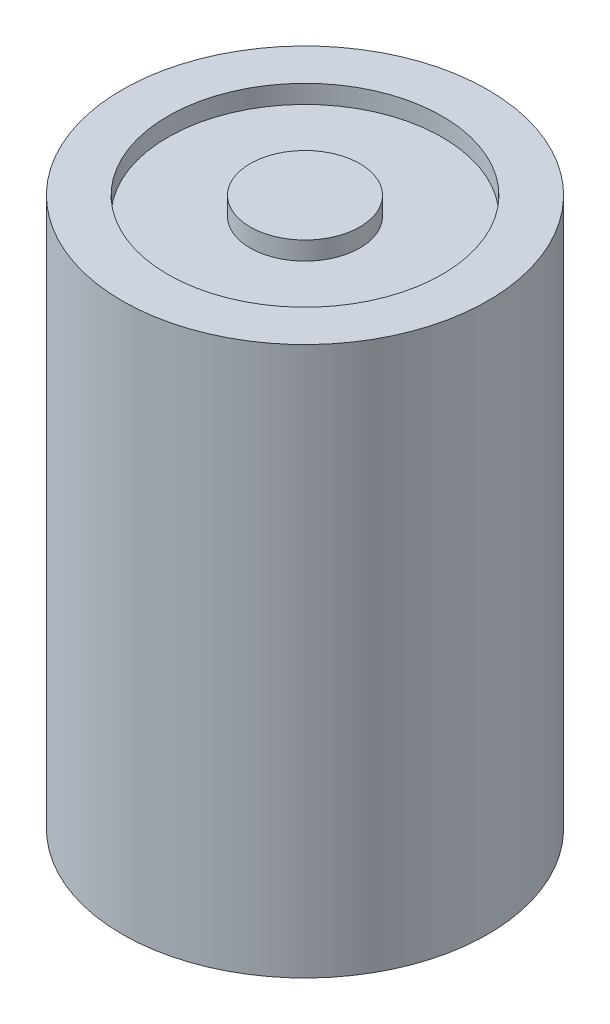
ISO-10303-21;
HEADER;
FILE_DESCRIPTION(('STEP AP214'),'2;1');
FILE_NAME('part.step','',(''),(''),'','','');
FILE_SCHEMA(('AUTOMOTIVE_DESIGN { 1 0 10303 214 1 1 1 1 }'));
ENDSEC;
DATA;
#1=APPLICATION_CONTEXT('core data for automotive mechanical design processes');
#2=APPLICATION_PROTOCOL_DEFINITION('international standard','automotive_design',2000,#1);
#3=PRODUCT_CONTEXT('',#1,'mechanical');
#4=PRODUCT('Part','Part','',(#3));
#5=PRODUCT_RELATED_PRODUCT_CATEGORY('part','',(#4));
#6=PRODUCT_DEFINITION_FORMATION('','',#4);
#7=PRODUCT_DEFINITION_CONTEXT('part definition',#1,'design');
#8=PRODUCT_DEFINITION('design','',#6,#7);
#9=PRODUCT_DEFINITION_SHAPE('','',#8);
#10=(LENGTH_UNIT() NAMED_UNIT(*) SI_UNIT(.MILLI.,.METRE.));
#11=(NAMED_UNIT(*) PLANE_ANGLE_UNIT() SI_UNIT($,.RADIAN.));
#12=(NAMED_UNIT(*) SI_UNIT($,.STERADIAN.) SOLID_ANGLE_UNIT());
#13=UNCERTAINTY_MEASURE_WITH_UNIT(LENGTH_MEASURE(1.E-05),#10,'distance_accuracy_value','');
#14=(GEOMETRIC_REPRESENTATION_CONTEXT(3) GLOBAL_UNCERTAINTY_ASSIGNED_CONTEXT((#13)) GLOBAL_UNIT_ASSIGNED_CONTEXT((#10,
#11,#12)) REPRESENTATION_CONTEXT('',''));
#15=CARTESIAN_POINT('',(0.,0.,0.));
#16=DIRECTION('',(0.,0.,1.));
#17=DIRECTION('',(1.,0.,0.));
#18=AXIS2_PLACEMENT_3D('',#15,#16,#17);
#19=CARTESIAN_POINT('',(0.,30.,0.));
#20=DIRECTION('',(0.,-1.,0.));
#21=DIRECTION('',(0.,0.,-1.));
#22=AXIS2_PLACEMENT_3D('',#19,#20,#21);
#23=CYLINDRICAL_SURFACE('',#22,10.);
#24=CARTESIAN_POINT('',(0.,30.,0.));
#25=DIRECTION('',(0.,1.,0.));
#26=DIRECTION('',(0.,0.,1.));
#27=AXIS2_PLACEMENT_3D('',#24,#25,#26);
#28=CIRCLE('',#27,10.);
#29=CARTESIAN_POINT('',(0.,30.,10.));
#30=VERTEX_POINT('',#29);
#31=EDGE_CURVE('E10',#30,#30,#28,.T.);
#32=ORIENTED_EDGE('',*,*,#31,.F.);
#33=EDGE_LOOP('',(#32));
#34=FACE_BOUND('',#33,.T.);
#35=CARTESIAN_POINT('',(0.,0.,0.));
#36=DIRECTION('',(0.,1.,0.));
#37=DIRECTION('',(0.,0.,1.));
#38=AXIS2_PLACEMENT_3D('',#35,#36,#37);
#39=CIRCLE('',#38,10.);
#40=CARTESIAN_POINT('',(0.,0.,10.));
#41=VERTEX_POINT('',#40);
#42=EDGE_CURVE('E46',#41,#41,#39,.T.);
#43=ORIENTED_EDGE('',*,*,#42,.T.);
#44=EDGE_LOOP('',(#43));
#45=FACE_BOUND('',#44,.T.);
#46=ADVANCED_FACE('F43',(#34,#45),#23,.T.);
#47=CARTESIAN_POINT('',(0.,30.,0.));
#48=DIRECTION('',(0.,1.,0.));
#49=DIRECTION('',(0.,0.,1.));
#50=AXIS2_PLACEMENT_3D('',#47,#48,#49);
#51=PLANE('',#50);
#52=CARTESIAN_POINT('',(0.,30.,0.));
#53=DIRECTION('',(0.,1.,0.));
#54=DIRECTION('',(0.,0.,1.));
#55=AXIS2_PLACEMENT_3D('',#52,#53,#54);
#56=CIRCLE('',#55,7.5);
#57=CARTESIAN_POINT('',(0.,30.,7.5));
#58=VERTEX_POINT('',#57);
#59=EDGE_CURVE('E57',#58,#58,#56,.T.);
#60=ORIENTED_EDGE('',*,*,#59,.F.);
#61=EDGE_LOOP('',(#60));
#62=FACE_BOUND('',#61,.T.);
#63=ORIENTED_EDGE('',*,*,#31,.T.);
#64=EDGE_LOOP('',(#63));
#65=FACE_BOUND('',#64,.T.);
#66=ADVANCED_FACE('F89',(#62,#65),#51,.T.);
#67=CARTESIAN_POINT('',(0.,0.,0.));
#68=DIRECTION('',(0.,1.,0.));
#69=DIRECTION('',(0.,0.,1.));
#70=AXIS2_PLACEMENT_3D('',#67,#68,#69);
#71=PLANE('',#70);
#72=ORIENTED_EDGE('',*,*,#42,.F.);
#73=EDGE_LOOP('',(#72));
#74=FACE_BOUND('',#73,.T.);
#75=ADVANCED_FACE('F85',(#74),#71,.F.);
#76=CARTESIAN_POINT('',(0.,29.,0.));
#77=DIRECTION('',(0.,1.,0.));
#78=DIRECTION('',(0.,0.,1.));
#79=AXIS2_PLACEMENT_3D('',#76,#77,#78);
#80=CYLINDRICAL_SURFACE('',#79,7.5);
#81=CARTESIAN_POINT('',(0.,29.,0.));
#82=DIRECTION('',(0.,1.,0.));
#83=DIRECTION('',(0.,0.,1.));
#84=AXIS2_PLACEMENT_3D('',#81,#82,#83);
#85=CIRCLE('',#84,7.5);
#86=CARTESIAN_POINT('',(0.,29.,7.5));
#87=VERTEX_POINT('',#86);
#88=EDGE_CURVE('E55',#87,#87,#85,.T.);
#89=ORIENTED_EDGE('',*,*,#88,.F.);
#90=EDGE_LOOP('',(#89));
#91=FACE_BOUND('',#90,.T.);
#92=ORIENTED_EDGE('',*,*,#59,.T.);
#93=EDGE_LOOP('',(#92));
#94=FACE_BOUND('',#93,.T.);
#95=ADVANCED_FACE('F79',(#91,#94),#80,.F.);
#96=CARTESIAN_POINT('',(0.,29.,0.));
#97=DIRECTION('',(0.,1.,0.));
#98=DIRECTION('',(0.,0.,1.));
#99=AXIS2_PLACEMENT_3D('',#96,#97,#98);
#100=PLANE('',#99);
#101=CARTESIAN_POINT('',(0.,29.,0.));
#102=DIRECTION('',(0.,1.,0.));
#103=DIRECTION('',(0.,0.,1.));
#104=AXIS2_PLACEMENT_3D('',#101,#102,#103);
#105=CIRCLE('',#104,3.);
#106=CARTESIAN_POINT('',(0.,29.,3.));
#107=VERTEX_POINT('',#106);
#108=EDGE_CURVE('E61',#107,#107,#105,.T.);
#109=ORIENTED_EDGE('',*,*,#108,.F.);
#110=EDGE_LOOP('',(#109));
#111=FACE_BOUND('',#110,.T.);
#112=ORIENTED_EDGE('',*,*,#88,.T.);
#113=EDGE_LOOP('',(#112));
#114=FACE_BOUND('',#113,.T.);
#115=ADVANCED_FACE('F76',(#111,#114),#100,.T.);
#116=CARTESIAN_POINT('',(0.,29.,0.));
#117=DIRECTION('',(0.,1.,0.));
#118=DIRECTION('',(0.,0.,1.));
#119=AXIS2_PLACEMENT_3D('',#116,#117,#118);
#120=CYLINDRICAL_SURFACE('',#119,3.);
#121=ORIENTED_EDGE('',*,*,#108,.T.);
#122=EDGE_LOOP('',(#121));
#123=FACE_BOUND('',#122,.T.);
#124=CARTESIAN_POINT('',(0.,30.,0.));
#125=DIRECTION('',(0.,1.,0.));
#126=DIRECTION('',(0.,0.,1.));
#127=AXIS2_PLACEMENT_3D('',#124,#125,#126);
#128=CIRCLE('',#127,3.);
#129=CARTESIAN_POINT('',(0.,30.,3.));
#130=VERTEX_POINT('',#129);
#131=EDGE_CURVE('E65',#130,#130,#128,.T.);
#132=ORIENTED_EDGE('',*,*,#131,.F.);
#133=EDGE_LOOP('',(#132));
#134=FACE_BOUND('',#133,.T.);
#135=ADVANCED_FACE('F73',(#123,#134),#120,.T.);
#136=ORIENTED_EDGE('',*,*,#131,.T.);
#137=EDGE_LOOP('',(#136));
#138=FACE_BOUND('',#137,.T.);
#139=ADVANCED_FACE('F92',(#138),#51,.T.);
#140=CLOSED_SHELL('',(#46,#66,#75,#95,#115,#135,#139));
#141=MANIFOLD_SOLID_BREP('B2',#140);
#142=ADVANCED_BREP_SHAPE_REPRESENTATION('',(#18,#141),#14);
#143=SHAPE_DEFINITION_REPRESENTATION(#9,#142);
ENDSEC;
END-ISO-10303-21;
